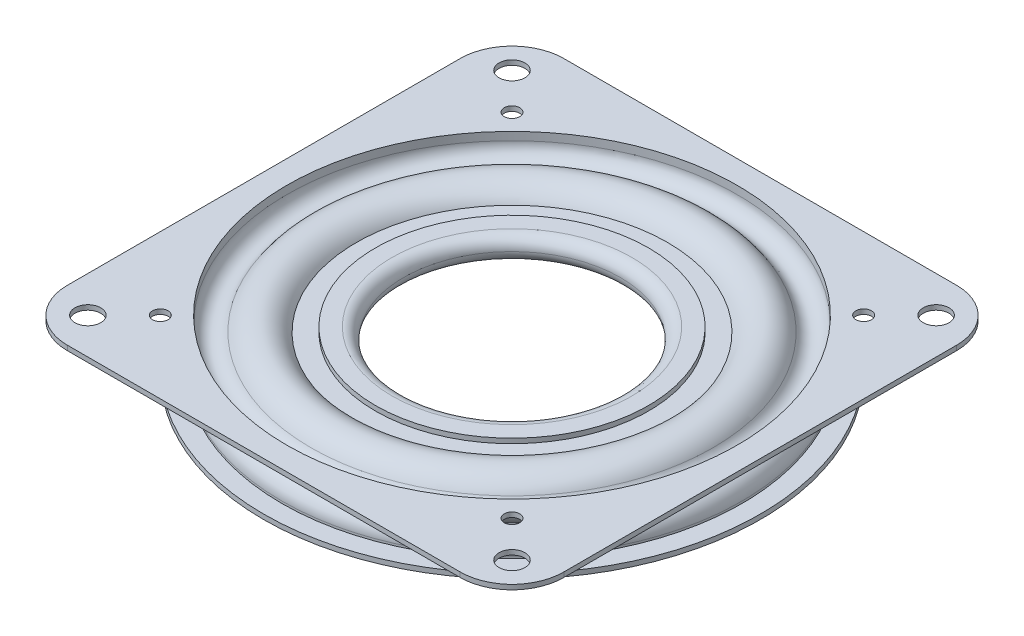
ISO-10303-21;
HEADER;
FILE_DESCRIPTION(('STEP AP214'),'2;1');
FILE_NAME('part.step','',(''),(''),'','','');
FILE_SCHEMA(('AUTOMOTIVE_DESIGN { 1 0 10303 214 1 1 1 1 }'));
ENDSEC;
DATA;
#1=APPLICATION_CONTEXT('core data for automotive mechanical design processes');
#2=APPLICATION_PROTOCOL_DEFINITION('international standard','automotive_design',2000,#1);
#3=PRODUCT_CONTEXT('',#1,'mechanical');
#4=PRODUCT('Part','Part','',(#3));
#5=PRODUCT_RELATED_PRODUCT_CATEGORY('part','',(#4));
#6=PRODUCT_DEFINITION_FORMATION('','',#4);
#7=PRODUCT_DEFINITION_CONTEXT('part definition',#1,'design');
#8=PRODUCT_DEFINITION('design','',#6,#7);
#9=PRODUCT_DEFINITION_SHAPE('','',#8);
#10=(LENGTH_UNIT() NAMED_UNIT(*) SI_UNIT(.MILLI.,.METRE.));
#11=(NAMED_UNIT(*) PLANE_ANGLE_UNIT() SI_UNIT($,.RADIAN.));
#12=(NAMED_UNIT(*) SI_UNIT($,.STERADIAN.) SOLID_ANGLE_UNIT());
#13=UNCERTAINTY_MEASURE_WITH_UNIT(LENGTH_MEASURE(1.E-05),#10,'distance_accuracy_value','');
#14=(GEOMETRIC_REPRESENTATION_CONTEXT(3) GLOBAL_UNCERTAINTY_ASSIGNED_CONTEXT((#13)) GLOBAL_UNIT_ASSIGNED_CONTEXT((#10,
#11,#12)) REPRESENTATION_CONTEXT('',''));
#15=CARTESIAN_POINT('',(0.,0.,0.));
#16=DIRECTION('',(0.,0.,1.));
#17=DIRECTION('',(1.,0.,0.));
#18=AXIS2_PLACEMENT_3D('',#15,#16,#17);
#19=CARTESIAN_POINT('',(-13.6842499999998,-0.850899999999998,-23.7018162634745));
#20=DIRECTION('',(0.,1.,0.));
#21=DIRECTION('',(-0.499999999999992,0.,-0.866025403784443));
#22=AXIS2_PLACEMENT_3D('',#19,#20,#21);
#23=SPHERICAL_SURFACE('',#22,3.36549999999999);
#24=CARTESIAN_POINT('',(-13.6842499999998,2.5146,-23.7018162634745));
#25=VERTEX_POINT('',#24);
#26=VERTEX_LOOP('',#25);
#27=FACE_BOUND('',#26,.T.);
#28=ADVANCED_FACE('F43',(#27),#23,.T.);
#29=CLOSED_SHELL('',(#28));
#30=MANIFOLD_SOLID_BREP('B2',#29);
#31=CARTESIAN_POINT('',(-13.6842500000001,-0.850899999999998,23.7018162634744));
#32=DIRECTION('',(0.,1.,0.));
#33=DIRECTION('',(-0.500000000000004,0.,0.866025403784436));
#34=AXIS2_PLACEMENT_3D('',#31,#32,#33);
#35=SPHERICAL_SURFACE('',#34,3.36549999999999);
#36=CARTESIAN_POINT('',(-13.6842500000001,2.5146,23.7018162634744));
#37=VERTEX_POINT('',#36);
#38=VERTEX_LOOP('',#37);
#39=FACE_BOUND('',#38,.T.);
#40=ADVANCED_FACE('F61',(#39),#35,.T.);
#41=CLOSED_SHELL('',(#40));
#42=MANIFOLD_SOLID_BREP('B7',#41);
#43=CARTESIAN_POINT('',(27.3685,-0.850899999999998,0.));
#44=DIRECTION('',(0.,1.,0.));
#45=DIRECTION('',(1.,0.,0.));
#46=AXIS2_PLACEMENT_3D('',#43,#44,#45);
#47=SPHERICAL_SURFACE('',#46,3.36549999999999);
#48=CARTESIAN_POINT('',(27.3685,2.5146,0.));
#49=VERTEX_POINT('',#48);
#50=VERTEX_LOOP('',#49);
#51=FACE_BOUND('',#50,.T.);
#52=ADVANCED_FACE('F83',(#51),#47,.T.);
#53=CLOSED_SHELL('',(#52));
#54=MANIFOLD_SOLID_BREP('B39',#53);
#55=CARTESIAN_POINT('',(34.557781480959,2.5654,0.));
#56=DIRECTION('',(0.,1.,0.));
#57=DIRECTION('',(0.,0.,1.));
#58=AXIS2_PLACEMENT_3D('',#55,#56,#57);
#59=PLANE('',#58);
#60=CARTESIAN_POINT('',(-26.9875,2.5654,-26.9875));
#61=DIRECTION('',(0.,1.,0.));
#62=DIRECTION('',(0.,0.,1.));
#63=AXIS2_PLACEMENT_3D('',#60,#61,#62);
#64=CIRCLE('',#63,1.19125999999999);
#65=CARTESIAN_POINT('',(-26.9875,2.5654,-25.79624));
#66=VERTEX_POINT('',#65);
#67=EDGE_CURVE('E347',#66,#66,#64,.T.);
#68=ORIENTED_EDGE('',*,*,#67,.T.);
#69=EDGE_LOOP('',(#68));
#70=FACE_BOUND('',#69,.T.);
#71=CARTESIAN_POINT('',(26.9875,2.5654,-26.9875));
#72=DIRECTION('',(0.,1.,0.));
#73=DIRECTION('',(0.,0.,1.));
#74=AXIS2_PLACEMENT_3D('',#71,#72,#73);
#75=CIRCLE('',#74,1.19125999999999);
#76=CARTESIAN_POINT('',(26.9875,2.5654,-25.79624));
#77=VERTEX_POINT('',#76);
#78=EDGE_CURVE('E341',#77,#77,#75,.T.);
#79=ORIENTED_EDGE('',*,*,#78,.T.);
#80=EDGE_LOOP('',(#79));
#81=FACE_BOUND('',#80,.T.);
#82=CARTESIAN_POINT('',(26.9875,2.5654,26.9875));
#83=DIRECTION('',(0.,1.,0.));
#84=DIRECTION('',(0.,0.,1.));
#85=AXIS2_PLACEMENT_3D('',#82,#83,#84);
#86=CIRCLE('',#85,1.19125999999999);
#87=CARTESIAN_POINT('',(26.9875,2.5654,28.17876));
#88=VERTEX_POINT('',#87);
#89=EDGE_CURVE('E335',#88,#88,#86,.T.);
#90=ORIENTED_EDGE('',*,*,#89,.T.);
#91=EDGE_LOOP('',(#90));
#92=FACE_BOUND('',#91,.T.);
#93=CARTESIAN_POINT('',(-26.9875,2.5654,26.9875));
#94=DIRECTION('',(0.,1.,0.));
#95=DIRECTION('',(0.,0.,1.));
#96=AXIS2_PLACEMENT_3D('',#93,#94,#95);
#97=CIRCLE('',#96,1.19125999999999);
#98=CARTESIAN_POINT('',(-26.9875,2.5654,28.17876));
#99=VERTEX_POINT('',#98);
#100=EDGE_CURVE('E329',#99,#99,#97,.T.);
#101=ORIENTED_EDGE('',*,*,#100,.T.);
#102=EDGE_LOOP('',(#101));
#103=FACE_BOUND('',#102,.T.);
#104=CARTESIAN_POINT('',(32.5501,2.5654,-32.5501));
#105=DIRECTION('',(0.,1.,0.));
#106=DIRECTION('',(0.,0.,1.));
#107=AXIS2_PLACEMENT_3D('',#104,#105,#106);
#108=CIRCLE('',#107,1.98437499999999);
#109=CARTESIAN_POINT('',(32.5501,2.5654,-30.565725));
#110=VERTEX_POINT('',#109);
#111=EDGE_CURVE('E323',#110,#110,#108,.T.);
#112=ORIENTED_EDGE('',*,*,#111,.T.);
#113=EDGE_LOOP('',(#112));
#114=FACE_BOUND('',#113,.T.);
#115=CARTESIAN_POINT('',(-32.5501,2.5654,-32.5501));
#116=DIRECTION('',(0.,1.,0.));
#117=DIRECTION('',(0.,0.,1.));
#118=AXIS2_PLACEMENT_3D('',#115,#116,#117);
#119=CIRCLE('',#118,1.98437499999999);
#120=CARTESIAN_POINT('',(-32.5501,2.5654,-30.565725));
#121=VERTEX_POINT('',#120);
#122=EDGE_CURVE('E317',#121,#121,#119,.T.);
#123=ORIENTED_EDGE('',*,*,#122,.T.);
#124=EDGE_LOOP('',(#123));
#125=FACE_BOUND('',#124,.T.);
#126=CARTESIAN_POINT('',(-32.5501,2.5654,32.5501));
#127=DIRECTION('',(0.,1.,0.));
#128=DIRECTION('',(0.,0.,1.));
#129=AXIS2_PLACEMENT_3D('',#126,#127,#128);
#130=CIRCLE('',#129,1.98437499999999);
#131=CARTESIAN_POINT('',(-32.5501,2.5654,34.534475));
#132=VERTEX_POINT('',#131);
#133=EDGE_CURVE('E311',#132,#132,#130,.T.);
#134=ORIENTED_EDGE('',*,*,#133,.T.);
#135=EDGE_LOOP('',(#134));
#136=FACE_BOUND('',#135,.T.);
#137=CARTESIAN_POINT('',(32.5501,2.5654,32.5501));
#138=DIRECTION('',(0.,1.,0.));
#139=DIRECTION('',(0.,0.,1.));
#140=AXIS2_PLACEMENT_3D('',#137,#138,#139);
#141=CIRCLE('',#140,1.98437499999999);
#142=CARTESIAN_POINT('',(32.5501,2.5654,34.534475));
#143=VERTEX_POINT('',#142);
#144=EDGE_CURVE('E301',#143,#143,#141,.T.);
#145=ORIENTED_EDGE('',*,*,#144,.T.);
#146=EDGE_LOOP('',(#145));
#147=FACE_BOUND('',#146,.T.);
#148=DIRECTION('',(0.,0.,-1.));
#149=VECTOR('',#148,1.);
#150=CARTESIAN_POINT('',(-38.1,2.5654,-38.1));
#151=LINE('',#150,#149);
#152=CARTESIAN_POINT('',(-38.1,2.5654,30.1498));
#153=VERTEX_POINT('',#152);
#154=CARTESIAN_POINT('',(-38.1,2.5654,-30.1498));
#155=VERTEX_POINT('',#154);
#156=EDGE_CURVE('E173',#153,#155,#151,.T.);
#157=ORIENTED_EDGE('',*,*,#156,.T.);
#158=CARTESIAN_POINT('',(-30.1498,2.5654,-30.1498));
#159=DIRECTION('',(0.,1.,0.));
#160=DIRECTION('',(0.,0.,1.));
#161=AXIS2_PLACEMENT_3D('',#158,#159,#160);
#162=CIRCLE('',#161,7.9502);
#163=CARTESIAN_POINT('',(-30.1498,2.5654,-38.1));
#164=VERTEX_POINT('',#163);
#165=EDGE_CURVE('E167',#155,#164,#162,.F.);
#166=ORIENTED_EDGE('',*,*,#165,.T.);
#167=DIRECTION('',(1.,0.,0.));
#168=VECTOR('',#167,1.);
#169=CARTESIAN_POINT('',(38.1,2.5654,-38.1));
#170=LINE('',#169,#168);
#171=CARTESIAN_POINT('',(30.1498,2.5654,-38.1));
#172=VERTEX_POINT('',#171);
#173=EDGE_CURVE('E170',#164,#172,#170,.T.);
#174=ORIENTED_EDGE('',*,*,#173,.T.);
#175=CARTESIAN_POINT('',(30.1498,2.5654,-30.1498));
#176=DIRECTION('',(0.,1.,0.));
#177=DIRECTION('',(0.,0.,1.));
#178=AXIS2_PLACEMENT_3D('',#175,#176,#177);
#179=CIRCLE('',#178,7.9502);
#180=CARTESIAN_POINT('',(38.1,2.5654,-30.1498));
#181=VERTEX_POINT('',#180);
#182=EDGE_CURVE('E178',#172,#181,#179,.F.);
#183=ORIENTED_EDGE('',*,*,#182,.T.);
#184=DIRECTION('',(0.,0.,1.));
#185=VECTOR('',#184,1.);
#186=CARTESIAN_POINT('',(38.1,2.5654,-38.1));
#187=LINE('',#186,#185);
#188=CARTESIAN_POINT('',(38.1,2.5654,30.1498));
#189=VERTEX_POINT('',#188);
#190=EDGE_CURVE('E189',#181,#189,#187,.T.);
#191=ORIENTED_EDGE('',*,*,#190,.T.);
#192=CARTESIAN_POINT('',(30.1498,2.5654,30.1498));
#193=DIRECTION('',(0.,1.,0.));
#194=DIRECTION('',(0.,0.,1.));
#195=AXIS2_PLACEMENT_3D('',#192,#193,#194);
#196=CIRCLE('',#195,7.9502);
#197=CARTESIAN_POINT('',(30.1498,2.5654,38.1));
#198=VERTEX_POINT('',#197);
#199=EDGE_CURVE('E122',#189,#198,#196,.F.);
#200=ORIENTED_EDGE('',*,*,#199,.T.);
#201=DIRECTION('',(-1.,0.,0.));
#202=VECTOR('',#201,1.);
#203=CARTESIAN_POINT('',(38.1,2.5654,38.1));
#204=LINE('',#203,#202);
#205=CARTESIAN_POINT('',(-30.1498,2.5654,38.1));
#206=VERTEX_POINT('',#205);
#207=EDGE_CURVE('E222',#198,#206,#204,.T.);
#208=ORIENTED_EDGE('',*,*,#207,.T.);
#209=CARTESIAN_POINT('',(-30.1498,2.5654,30.1498));
#210=DIRECTION('',(0.,1.,0.));
#211=DIRECTION('',(0.,0.,1.));
#212=AXIS2_PLACEMENT_3D('',#209,#210,#211);
#213=CIRCLE('',#212,7.9502);
#214=EDGE_CURVE('E211',#206,#153,#213,.F.);
#215=ORIENTED_EDGE('',*,*,#214,.T.);
#216=EDGE_LOOP('',(#157,#166,#174,#183,#191,#200,#208,#215));
#217=FACE_BOUND('',#216,.T.);
#218=CARTESIAN_POINT('',(0.,2.5654,0.));
#219=DIRECTION('',(0.,1.,0.));
#220=DIRECTION('',(0.,0.,1.));
#221=AXIS2_PLACEMENT_3D('',#218,#219,#220);
#222=CIRCLE('',#221,35.294381480959);
#223=CARTESIAN_POINT('',(0.,2.5654,35.294381480959));
#224=VERTEX_POINT('',#223);
#225=EDGE_CURVE('E188',#224,#224,#222,.T.);
#226=ORIENTED_EDGE('',*,*,#225,.T.);
#227=EDGE_LOOP('',(#226));
#228=FACE_BOUND('',#227,.T.);
#229=ADVANCED_FACE('F102',(#70,#81,#92,#103,#114,#125,#136,#147,#217,#228),#59,.F.);
#230=CARTESIAN_POINT('',(34.557781480959,3.302,0.));
#231=DIRECTION('',(0.,1.,0.));
#232=DIRECTION('',(0.,0.,1.));
#233=AXIS2_PLACEMENT_3D('',#230,#231,#232);
#234=PLANE('',#233);
#235=CARTESIAN_POINT('',(-26.9875,3.302,-26.9875));
#236=DIRECTION('',(0.,1.,0.));
#237=DIRECTION('',(0.,0.,1.));
#238=AXIS2_PLACEMENT_3D('',#235,#236,#237);
#239=CIRCLE('',#238,1.19125999999999);
#240=CARTESIAN_POINT('',(-26.9875,3.302,-25.79624));
#241=VERTEX_POINT('',#240);
#242=EDGE_CURVE('E350',#241,#241,#239,.T.);
#243=ORIENTED_EDGE('',*,*,#242,.F.);
#244=EDGE_LOOP('',(#243));
#245=FACE_BOUND('',#244,.T.);
#246=CARTESIAN_POINT('',(26.9875,3.302,-26.9875));
#247=DIRECTION('',(0.,1.,0.));
#248=DIRECTION('',(0.,0.,1.));
#249=AXIS2_PLACEMENT_3D('',#246,#247,#248);
#250=CIRCLE('',#249,1.19125999999999);
#251=CARTESIAN_POINT('',(26.9875,3.302,-25.79624));
#252=VERTEX_POINT('',#251);
#253=EDGE_CURVE('E344',#252,#252,#250,.T.);
#254=ORIENTED_EDGE('',*,*,#253,.F.);
#255=EDGE_LOOP('',(#254));
#256=FACE_BOUND('',#255,.T.);
#257=CARTESIAN_POINT('',(26.9875,3.302,26.9875));
#258=DIRECTION('',(0.,1.,0.));
#259=DIRECTION('',(0.,0.,1.));
#260=AXIS2_PLACEMENT_3D('',#257,#258,#259);
#261=CIRCLE('',#260,1.19125999999999);
#262=CARTESIAN_POINT('',(26.9875,3.302,28.17876));
#263=VERTEX_POINT('',#262);
#264=EDGE_CURVE('E338',#263,#263,#261,.T.);
#265=ORIENTED_EDGE('',*,*,#264,.F.);
#266=EDGE_LOOP('',(#265));
#267=FACE_BOUND('',#266,.T.);
#268=CARTESIAN_POINT('',(-26.9875,3.302,26.9875));
#269=DIRECTION('',(0.,1.,0.));
#270=DIRECTION('',(0.,0.,1.));
#271=AXIS2_PLACEMENT_3D('',#268,#269,#270);
#272=CIRCLE('',#271,1.19125999999999);
#273=CARTESIAN_POINT('',(-26.9875,3.302,28.17876));
#274=VERTEX_POINT('',#273);
#275=EDGE_CURVE('E332',#274,#274,#272,.T.);
#276=ORIENTED_EDGE('',*,*,#275,.F.);
#277=EDGE_LOOP('',(#276));
#278=FACE_BOUND('',#277,.T.);
#279=CARTESIAN_POINT('',(32.5501,3.302,-32.5501));
#280=DIRECTION('',(0.,1.,0.));
#281=DIRECTION('',(0.,0.,1.));
#282=AXIS2_PLACEMENT_3D('',#279,#280,#281);
#283=CIRCLE('',#282,1.98437499999999);
#284=CARTESIAN_POINT('',(32.5501,3.302,-30.565725));
#285=VERTEX_POINT('',#284);
#286=EDGE_CURVE('E326',#285,#285,#283,.T.);
#287=ORIENTED_EDGE('',*,*,#286,.F.);
#288=EDGE_LOOP('',(#287));
#289=FACE_BOUND('',#288,.T.);
#290=CARTESIAN_POINT('',(-32.5501,3.302,-32.5501));
#291=DIRECTION('',(0.,1.,0.));
#292=DIRECTION('',(0.,0.,1.));
#293=AXIS2_PLACEMENT_3D('',#290,#291,#292);
#294=CIRCLE('',#293,1.98437499999999);
#295=CARTESIAN_POINT('',(-32.5501,3.302,-30.565725));
#296=VERTEX_POINT('',#295);
#297=EDGE_CURVE('E320',#296,#296,#294,.T.);
#298=ORIENTED_EDGE('',*,*,#297,.F.);
#299=EDGE_LOOP('',(#298));
#300=FACE_BOUND('',#299,.T.);
#301=CARTESIAN_POINT('',(-32.5501,3.302,32.5501));
#302=DIRECTION('',(0.,1.,0.));
#303=DIRECTION('',(0.,0.,1.));
#304=AXIS2_PLACEMENT_3D('',#301,#302,#303);
#305=CIRCLE('',#304,1.98437499999999);
#306=CARTESIAN_POINT('',(-32.5501,3.302,34.534475));
#307=VERTEX_POINT('',#306);
#308=EDGE_CURVE('E314',#307,#307,#305,.T.);
#309=ORIENTED_EDGE('',*,*,#308,.F.);
#310=EDGE_LOOP('',(#309));
#311=FACE_BOUND('',#310,.T.);
#312=CARTESIAN_POINT('',(32.5501,3.302,32.5501));
#313=DIRECTION('',(0.,1.,0.));
#314=DIRECTION('',(0.,0.,1.));
#315=AXIS2_PLACEMENT_3D('',#312,#313,#314);
#316=CIRCLE('',#315,1.98437499999999);
#317=CARTESIAN_POINT('',(32.5501,3.302,34.534475));
#318=VERTEX_POINT('',#317);
#319=EDGE_CURVE('E308',#318,#318,#316,.T.);
#320=ORIENTED_EDGE('',*,*,#319,.F.);
#321=EDGE_LOOP('',(#320));
#322=FACE_BOUND('',#321,.T.);
#323=DIRECTION('',(-1.,0.,0.));
#324=VECTOR('',#323,1.);
#325=CARTESIAN_POINT('',(38.1,3.302,-38.1));
#326=LINE('',#325,#324);
#327=CARTESIAN_POINT('',(30.1498,3.302,-38.1));
#328=VERTEX_POINT('',#327);
#329=CARTESIAN_POINT('',(-30.1498,3.302,-38.1));
#330=VERTEX_POINT('',#329);
#331=EDGE_CURVE('E233',#328,#330,#326,.T.);
#332=ORIENTED_EDGE('',*,*,#331,.T.);
#333=CARTESIAN_POINT('',(-30.1498,3.302,-30.1498));
#334=DIRECTION('',(0.,1.,0.));
#335=DIRECTION('',(0.,0.,1.));
#336=AXIS2_PLACEMENT_3D('',#333,#334,#335);
#337=CIRCLE('',#336,7.9502);
#338=CARTESIAN_POINT('',(-38.1,3.302,-30.1498));
#339=VERTEX_POINT('',#338);
#340=EDGE_CURVE('E192',#330,#339,#337,.T.);
#341=ORIENTED_EDGE('',*,*,#340,.T.);
#342=DIRECTION('',(0.,0.,1.));
#343=VECTOR('',#342,1.);
#344=CARTESIAN_POINT('',(-38.1,3.302,-38.1));
#345=LINE('',#344,#343);
#346=CARTESIAN_POINT('',(-38.1,3.302,30.1498));
#347=VERTEX_POINT('',#346);
#348=EDGE_CURVE('E230',#339,#347,#345,.T.);
#349=ORIENTED_EDGE('',*,*,#348,.T.);
#350=CARTESIAN_POINT('',(-30.1498,3.302,30.1498));
#351=DIRECTION('',(0.,1.,0.));
#352=DIRECTION('',(0.,0.,1.));
#353=AXIS2_PLACEMENT_3D('',#350,#351,#352);
#354=CIRCLE('',#353,7.9502);
#355=CARTESIAN_POINT('',(-30.1498,3.302,38.1));
#356=VERTEX_POINT('',#355);
#357=EDGE_CURVE('E195',#347,#356,#354,.T.);
#358=ORIENTED_EDGE('',*,*,#357,.T.);
#359=DIRECTION('',(1.,0.,0.));
#360=VECTOR('',#359,1.);
#361=CARTESIAN_POINT('',(38.1,3.302,38.1));
#362=LINE('',#361,#360);
#363=CARTESIAN_POINT('',(30.1498,3.302,38.1));
#364=VERTEX_POINT('',#363);
#365=EDGE_CURVE('E221',#356,#364,#362,.T.);
#366=ORIENTED_EDGE('',*,*,#365,.T.);
#367=CARTESIAN_POINT('',(30.1498,3.302,30.1498));
#368=DIRECTION('',(0.,1.,0.));
#369=DIRECTION('',(0.,0.,1.));
#370=AXIS2_PLACEMENT_3D('',#367,#368,#369);
#371=CIRCLE('',#370,7.9502);
#372=CARTESIAN_POINT('',(38.1,3.302,30.1498));
#373=VERTEX_POINT('',#372);
#374=EDGE_CURVE('E193',#364,#373,#371,.T.);
#375=ORIENTED_EDGE('',*,*,#374,.T.);
#376=DIRECTION('',(0.,0.,-1.));
#377=VECTOR('',#376,1.);
#378=CARTESIAN_POINT('',(38.1,3.302,-38.1));
#379=LINE('',#378,#377);
#380=CARTESIAN_POINT('',(38.1,3.302,-30.1498));
#381=VERTEX_POINT('',#380);
#382=EDGE_CURVE('E300',#373,#381,#379,.T.);
#383=ORIENTED_EDGE('',*,*,#382,.T.);
#384=CARTESIAN_POINT('',(30.1498,3.302,-30.1498));
#385=DIRECTION('',(0.,1.,0.));
#386=DIRECTION('',(0.,0.,1.));
#387=AXIS2_PLACEMENT_3D('',#384,#385,#386);
#388=CIRCLE('',#387,7.9502);
#389=EDGE_CURVE('E202',#381,#328,#388,.T.);
#390=ORIENTED_EDGE('',*,*,#389,.T.);
#391=EDGE_LOOP('',(#332,#341,#349,#358,#366,#375,#383,#390));
#392=FACE_BOUND('',#391,.T.);
#393=CARTESIAN_POINT('',(0.,3.302,0.));
#394=DIRECTION('',(0.,1.,0.));
#395=DIRECTION('',(0.,0.,1.));
#396=AXIS2_PLACEMENT_3D('',#393,#394,#395);
#397=CIRCLE('',#396,34.557781480959);
#398=CARTESIAN_POINT('',(0.,3.302,34.557781480959));
#399=VERTEX_POINT('',#398);
#400=EDGE_CURVE('E197',#399,#399,#397,.T.);
#401=ORIENTED_EDGE('',*,*,#400,.F.);
#402=EDGE_LOOP('',(#401));
#403=FACE_BOUND('',#402,.T.);
#404=ADVANCED_FACE('F225',(#245,#256,#267,#278,#289,#300,#311,#322,#392,#403),#234,.T.);
#405=CARTESIAN_POINT('',(0.,21.7127262600922,0.));
#406=DIRECTION('',(0.,1.,0.));
#407=DIRECTION('',(0.,0.,1.));
#408=AXIS2_PLACEMENT_3D('',#405,#406,#407);
#409=CYLINDRICAL_SURFACE('',#408,34.557781480959);
#410=ORIENTED_EDGE('',*,*,#400,.T.);
#411=EDGE_LOOP('',(#410));
#412=FACE_BOUND('',#411,.T.);
#413=CARTESIAN_POINT('',(0.,2.06375000000002,0.));
#414=DIRECTION('',(0.,1.,0.));
#415=DIRECTION('',(0.,0.,1.));
#416=AXIS2_PLACEMENT_3D('',#413,#414,#415);
#417=CIRCLE('',#416,34.557781480959);
#418=CARTESIAN_POINT('',(0.,2.06375000000002,34.557781480959));
#419=VERTEX_POINT('',#418);
#420=EDGE_CURVE('E260',#419,#419,#417,.T.);
#421=ORIENTED_EDGE('',*,*,#420,.F.);
#422=EDGE_LOOP('',(#421));
#423=FACE_BOUND('',#422,.T.);
#424=ADVANCED_FACE('F265',(#412,#423),#409,.F.);
#425=CARTESIAN_POINT('',(0.,2.06375000000002,0.));
#426=DIRECTION('',(0.,1.,0.));
#427=DIRECTION('',(0.,0.,1.));
#428=AXIS2_PLACEMENT_3D('',#425,#426,#427);
#429=TOROIDAL_SURFACE('',#428,32.570231480959,1.98755);
#430=ORIENTED_EDGE('',*,*,#420,.T.);
#431=EDGE_LOOP('',(#430));
#432=FACE_BOUND('',#431,.T.);
#433=CARTESIAN_POINT('',(0.,1.09220000000001,0.));
#434=DIRECTION('',(0.,1.,0.));
#435=DIRECTION('',(0.,0.,1.));
#436=AXIS2_PLACEMENT_3D('',#433,#434,#435);
#437=CIRCLE('',#436,30.836320987306);
#438=CARTESIAN_POINT('',(0.,1.09220000000001,30.836320987306));
#439=VERTEX_POINT('',#438);
#440=EDGE_CURVE('E257',#439,#439,#437,.T.);
#441=ORIENTED_EDGE('',*,*,#440,.F.);
#442=EDGE_LOOP('',(#441));
#443=FACE_BOUND('',#442,.T.);
#444=ADVANCED_FACE('F274',(#432,#443),#429,.F.);
#445=CARTESIAN_POINT('',(0.,-0.850899999999998,0.));
#446=DIRECTION('',(0.,1.,0.));
#447=DIRECTION('',(0.,0.,1.));
#448=AXIS2_PLACEMENT_3D('',#445,#446,#447);
#449=TOROIDAL_SURFACE('',#448,27.3685,3.9751);
#450=ORIENTED_EDGE('',*,*,#440,.T.);
#451=EDGE_LOOP('',(#450));
#452=FACE_BOUND('',#451,.T.);
#453=CARTESIAN_POINT('',(0.,1.0414,0.));
#454=DIRECTION('',(0.,1.,0.));
#455=DIRECTION('',(0.,0.,1.));
#456=AXIS2_PLACEMENT_3D('',#453,#454,#455);
#457=CIRCLE('',#456,23.8726995594714);
#458=CARTESIAN_POINT('',(0.,1.0414,23.8726995594714));
#459=VERTEX_POINT('',#458);
#460=EDGE_CURVE('E254',#459,#459,#457,.T.);
#461=ORIENTED_EDGE('',*,*,#460,.F.);
#462=EDGE_LOOP('',(#461));
#463=FACE_BOUND('',#462,.T.);
#464=ADVANCED_FACE('F418',(#452,#463),#449,.T.);
#465=CARTESIAN_POINT('',(18.415,1.0414,0.));
#466=DIRECTION('',(0.,1.,0.));
#467=DIRECTION('',(0.,0.,1.));
#468=AXIS2_PLACEMENT_3D('',#465,#466,#467);
#469=PLANE('',#468);
#470=ORIENTED_EDGE('',*,*,#460,.T.);
#471=EDGE_LOOP('',(#470));
#472=FACE_BOUND('',#471,.T.);
#473=CARTESIAN_POINT('',(0.,1.0414,0.));
#474=DIRECTION('',(0.,1.,0.));
#475=DIRECTION('',(0.,0.,1.));
#476=AXIS2_PLACEMENT_3D('',#473,#474,#475);
#477=CIRCLE('',#476,18.415);
#478=CARTESIAN_POINT('',(0.,1.0414,18.415));
#479=VERTEX_POINT('',#478);
#480=EDGE_CURVE('E251',#479,#479,#477,.T.);
#481=ORIENTED_EDGE('',*,*,#480,.F.);
#482=EDGE_LOOP('',(#481));
#483=FACE_BOUND('',#482,.T.);
#484=ADVANCED_FACE('F414',(#472,#483),#469,.T.);
#485=CARTESIAN_POINT('',(0.,21.7127262600922,0.));
#486=DIRECTION('',(0.,1.,0.));
#487=DIRECTION('',(0.,0.,1.));
#488=AXIS2_PLACEMENT_3D('',#485,#486,#487);
#489=CYLINDRICAL_SURFACE('',#488,18.415);
#490=ORIENTED_EDGE('',*,*,#480,.T.);
#491=EDGE_LOOP('',(#490));
#492=FACE_BOUND('',#491,.T.);
#493=CARTESIAN_POINT('',(0.,0.304800000000001,0.));
#494=DIRECTION('',(0.,1.,0.));
#495=DIRECTION('',(0.,0.,1.));
#496=AXIS2_PLACEMENT_3D('',#493,#494,#495);
#497=CIRCLE('',#496,18.415);
#498=CARTESIAN_POINT('',(0.,0.304800000000001,18.415));
#499=VERTEX_POINT('',#498);
#500=EDGE_CURVE('E248',#499,#499,#497,.T.);
#501=ORIENTED_EDGE('',*,*,#500,.F.);
#502=EDGE_LOOP('',(#501));
#503=FACE_BOUND('',#502,.T.);
#504=ADVANCED_FACE('F410',(#492,#503),#489,.F.);
#505=CARTESIAN_POINT('',(18.415,0.304800000000001,0.));
#506=DIRECTION('',(0.,1.,0.));
#507=DIRECTION('',(0.,0.,1.));
#508=AXIS2_PLACEMENT_3D('',#505,#506,#507);
#509=PLANE('',#508);
#510=CARTESIAN_POINT('',(0.,0.304800000000001,0.));
#511=DIRECTION('',(0.,1.,0.));
#512=DIRECTION('',(0.,0.,1.));
#513=AXIS2_PLACEMENT_3D('',#510,#511,#512);
#514=CIRCLE('',#513,24.3432331092943);
#515=CARTESIAN_POINT('',(0.,0.304800000000001,24.3432331092943));
#516=VERTEX_POINT('',#515);
#517=EDGE_CURVE('E245',#516,#516,#514,.T.);
#518=ORIENTED_EDGE('',*,*,#517,.F.);
#519=EDGE_LOOP('',(#518));
#520=FACE_BOUND('',#519,.T.);
#521=ORIENTED_EDGE('',*,*,#500,.T.);
#522=EDGE_LOOP('',(#521));
#523=FACE_BOUND('',#522,.T.);
#524=ADVANCED_FACE('F406',(#520,#523),#509,.F.);
#525=CARTESIAN_POINT('',(0.,-0.850899999999998,0.));
#526=DIRECTION('',(0.,1.,0.));
#527=DIRECTION('',(0.,0.,1.));
#528=AXIS2_PLACEMENT_3D('',#525,#526,#527);
#529=TOROIDAL_SURFACE('',#528,27.3685,3.2385);
#530=CARTESIAN_POINT('',(0.,0.732136741214071,0.));
#531=DIRECTION('',(0.,1.,0.));
#532=DIRECTION('',(0.,0.,1.));
#533=AXIS2_PLACEMENT_3D('',#530,#531,#532);
#534=CIRCLE('',#533,30.1937215711279);
#535=CARTESIAN_POINT('',(0.,0.732136741214071,30.1937215711279));
#536=VERTEX_POINT('',#535);
#537=EDGE_CURVE('E242',#536,#536,#534,.T.);
#538=ORIENTED_EDGE('',*,*,#537,.F.);
#539=EDGE_LOOP('',(#538));
#540=FACE_BOUND('',#539,.T.);
#541=ORIENTED_EDGE('',*,*,#517,.T.);
#542=EDGE_LOOP('',(#541));
#543=FACE_BOUND('',#542,.T.);
#544=ADVANCED_FACE('F402',(#540,#543),#529,.F.);
#545=CARTESIAN_POINT('',(0.,2.06375000000002,0.));
#546=DIRECTION('',(0.,1.,0.));
#547=DIRECTION('',(0.,0.,1.));
#548=AXIS2_PLACEMENT_3D('',#545,#546,#547);
#549=TOROIDAL_SURFACE('',#548,32.570231480959,2.72415);
#550=CARTESIAN_POINT('',(0.,2.06375000000002,0.));
#551=DIRECTION('',(0.,1.,0.));
#552=DIRECTION('',(0.,0.,1.));
#553=AXIS2_PLACEMENT_3D('',#550,#551,#552);
#554=CIRCLE('',#553,35.294381480959);
#555=CARTESIAN_POINT('',(0.,2.06375000000002,35.294381480959));
#556=VERTEX_POINT('',#555);
#557=EDGE_CURVE('E239',#556,#556,#554,.T.);
#558=ORIENTED_EDGE('',*,*,#557,.F.);
#559=EDGE_LOOP('',(#558));
#560=FACE_BOUND('',#559,.T.);
#561=ORIENTED_EDGE('',*,*,#537,.T.);
#562=EDGE_LOOP('',(#561));
#563=FACE_BOUND('',#562,.T.);
#564=ADVANCED_FACE('F398',(#560,#563),#549,.T.);
#565=CARTESIAN_POINT('',(0.,21.7127262600922,0.));
#566=DIRECTION('',(0.,1.,0.));
#567=DIRECTION('',(0.,0.,1.));
#568=AXIS2_PLACEMENT_3D('',#565,#566,#567);
#569=CYLINDRICAL_SURFACE('',#568,35.294381480959);
#570=ORIENTED_EDGE('',*,*,#225,.F.);
#571=EDGE_LOOP('',(#570));
#572=FACE_BOUND('',#571,.T.);
#573=ORIENTED_EDGE('',*,*,#557,.T.);
#574=EDGE_LOOP('',(#573));
#575=FACE_BOUND('',#574,.T.);
#576=ADVANCED_FACE('F392',(#572,#575),#569,.T.);
#577=CARTESIAN_POINT('',(38.1,-105.19767345283,-38.1));
#578=DIRECTION('',(0.,0.,-1.));
#579=DIRECTION('',(-1.,0.,0.));
#580=AXIS2_PLACEMENT_3D('',#577,#578,#579);
#581=PLANE('',#580);
#582=ORIENTED_EDGE('',*,*,#173,.F.);
#583=DIRECTION('',(0.,1.,0.));
#584=VECTOR('',#583,1.);
#585=CARTESIAN_POINT('',(-30.1498,-105.19767345283,-38.1));
#586=LINE('',#585,#584);
#587=EDGE_CURVE('E184',#164,#330,#586,.T.);
#588=ORIENTED_EDGE('',*,*,#587,.T.);
#589=ORIENTED_EDGE('',*,*,#331,.F.);
#590=DIRECTION('',(0.,1.,0.));
#591=VECTOR('',#590,1.);
#592=CARTESIAN_POINT('',(30.1498,-105.19767345283,-38.1));
#593=LINE('',#592,#591);
#594=EDGE_CURVE('E187',#328,#172,#593,.F.);
#595=ORIENTED_EDGE('',*,*,#594,.T.);
#596=EDGE_LOOP('',(#582,#588,#589,#595));
#597=FACE_BOUND('',#596,.T.);
#598=ADVANCED_FACE('F182',(#597),#581,.T.);
#599=CARTESIAN_POINT('',(-38.1,-105.19767345283,-38.1));
#600=DIRECTION('',(-1.,0.,0.));
#601=DIRECTION('',(0.,0.,1.));
#602=AXIS2_PLACEMENT_3D('',#599,#600,#601);
#603=PLANE('',#602);
#604=ORIENTED_EDGE('',*,*,#348,.F.);
#605=DIRECTION('',(0.,1.,0.));
#606=VECTOR('',#605,1.);
#607=CARTESIAN_POINT('',(-38.1,-105.19767345283,-30.1498));
#608=LINE('',#607,#606);
#609=EDGE_CURVE('E208',#339,#155,#608,.F.);
#610=ORIENTED_EDGE('',*,*,#609,.T.);
#611=ORIENTED_EDGE('',*,*,#156,.F.);
#612=DIRECTION('',(0.,1.,0.));
#613=VECTOR('',#612,1.);
#614=CARTESIAN_POINT('',(-38.1,-105.19767345283,30.1498));
#615=LINE('',#614,#613);
#616=EDGE_CURVE('E205',#153,#347,#615,.T.);
#617=ORIENTED_EDGE('',*,*,#616,.T.);
#618=EDGE_LOOP('',(#604,#610,#611,#617));
#619=FACE_BOUND('',#618,.T.);
#620=ADVANCED_FACE('F299',(#619),#603,.T.);
#621=CARTESIAN_POINT('',(38.1,-105.19767345283,38.1));
#622=DIRECTION('',(0.,0.,1.));
#623=DIRECTION('',(1.,0.,0.));
#624=AXIS2_PLACEMENT_3D('',#621,#622,#623);
#625=PLANE('',#624);
#626=ORIENTED_EDGE('',*,*,#365,.F.);
#627=DIRECTION('',(0.,1.,0.));
#628=VECTOR('',#627,1.);
#629=CARTESIAN_POINT('',(-30.1498,-105.19767345283,38.1));
#630=LINE('',#629,#628);
#631=EDGE_CURVE('E81',#356,#206,#630,.F.);
#632=ORIENTED_EDGE('',*,*,#631,.T.);
#633=ORIENTED_EDGE('',*,*,#207,.F.);
#634=DIRECTION('',(0.,1.,0.));
#635=VECTOR('',#634,1.);
#636=CARTESIAN_POINT('',(30.1498,-105.19767345283,38.1));
#637=LINE('',#636,#635);
#638=EDGE_CURVE('E110',#198,#364,#637,.T.);
#639=ORIENTED_EDGE('',*,*,#638,.T.);
#640=EDGE_LOOP('',(#626,#632,#633,#639));
#641=FACE_BOUND('',#640,.T.);
#642=ADVANCED_FACE('F220',(#641),#625,.T.);
#643=CARTESIAN_POINT('',(38.1,-105.19767345283,-38.1));
#644=DIRECTION('',(1.,0.,0.));
#645=DIRECTION('',(0.,0.,-1.));
#646=AXIS2_PLACEMENT_3D('',#643,#644,#645);
#647=PLANE('',#646);
#648=ORIENTED_EDGE('',*,*,#190,.F.);
#649=DIRECTION('',(0.,1.,0.));
#650=VECTOR('',#649,1.);
#651=CARTESIAN_POINT('',(38.1,-105.19767345283,-30.1498));
#652=LINE('',#651,#650);
#653=EDGE_CURVE('E215',#181,#381,#652,.T.);
#654=ORIENTED_EDGE('',*,*,#653,.T.);
#655=ORIENTED_EDGE('',*,*,#382,.F.);
#656=DIRECTION('',(0.,1.,0.));
#657=VECTOR('',#656,1.);
#658=CARTESIAN_POINT('',(38.1,-105.19767345283,30.1498));
#659=LINE('',#658,#657);
#660=EDGE_CURVE('E177',#373,#189,#659,.F.);
#661=ORIENTED_EDGE('',*,*,#660,.T.);
#662=EDGE_LOOP('',(#648,#654,#655,#661));
#663=FACE_BOUND('',#662,.T.);
#664=ADVANCED_FACE('F285',(#663),#647,.T.);
#665=CARTESIAN_POINT('',(-30.1498,-105.19767345283,-30.1498));
#666=DIRECTION('',(0.,1.,0.));
#667=DIRECTION('',(0.,0.,1.));
#668=AXIS2_PLACEMENT_3D('',#665,#666,#667);
#669=CYLINDRICAL_SURFACE('',#668,7.9502);
#670=ORIENTED_EDGE('',*,*,#165,.F.);
#671=ORIENTED_EDGE('',*,*,#609,.F.);
#672=ORIENTED_EDGE('',*,*,#340,.F.);
#673=ORIENTED_EDGE('',*,*,#587,.F.);
#674=EDGE_LOOP('',(#670,#671,#672,#673));
#675=FACE_BOUND('',#674,.T.);
#676=ADVANCED_FACE('F191',(#675),#669,.T.);
#677=CARTESIAN_POINT('',(30.1498,-105.19767345283,-30.1498));
#678=DIRECTION('',(0.,1.,0.));
#679=DIRECTION('',(0.,0.,1.));
#680=AXIS2_PLACEMENT_3D('',#677,#678,#679);
#681=CYLINDRICAL_SURFACE('',#680,7.9502);
#682=ORIENTED_EDGE('',*,*,#182,.F.);
#683=ORIENTED_EDGE('',*,*,#594,.F.);
#684=ORIENTED_EDGE('',*,*,#389,.F.);
#685=ORIENTED_EDGE('',*,*,#653,.F.);
#686=EDGE_LOOP('',(#682,#683,#684,#685));
#687=FACE_BOUND('',#686,.T.);
#688=ADVANCED_FACE('F284',(#687),#681,.T.);
#689=CARTESIAN_POINT('',(-30.1498,-105.19767345283,30.1498));
#690=DIRECTION('',(0.,1.,0.));
#691=DIRECTION('',(0.,0.,1.));
#692=AXIS2_PLACEMENT_3D('',#689,#690,#691);
#693=CYLINDRICAL_SURFACE('',#692,7.9502);
#694=ORIENTED_EDGE('',*,*,#214,.F.);
#695=ORIENTED_EDGE('',*,*,#631,.F.);
#696=ORIENTED_EDGE('',*,*,#357,.F.);
#697=ORIENTED_EDGE('',*,*,#616,.F.);
#698=EDGE_LOOP('',(#694,#695,#696,#697));
#699=FACE_BOUND('',#698,.T.);
#700=ADVANCED_FACE('F287',(#699),#693,.T.);
#701=CARTESIAN_POINT('',(30.1498,-105.19767345283,30.1498));
#702=DIRECTION('',(0.,1.,0.));
#703=DIRECTION('',(0.,0.,1.));
#704=AXIS2_PLACEMENT_3D('',#701,#702,#703);
#705=CYLINDRICAL_SURFACE('',#704,7.9502);
#706=ORIENTED_EDGE('',*,*,#199,.F.);
#707=ORIENTED_EDGE('',*,*,#660,.F.);
#708=ORIENTED_EDGE('',*,*,#374,.F.);
#709=ORIENTED_EDGE('',*,*,#638,.F.);
#710=EDGE_LOOP('',(#706,#707,#708,#709));
#711=FACE_BOUND('',#710,.T.);
#712=ADVANCED_FACE('F104',(#711),#705,.T.);
#713=CARTESIAN_POINT('',(32.5501,3.302,32.5501));
#714=DIRECTION('',(0.,1.,0.));
#715=DIRECTION('',(0.,0.,1.));
#716=AXIS2_PLACEMENT_3D('',#713,#714,#715);
#717=CYLINDRICAL_SURFACE('',#716,1.98437499999999);
#718=ORIENTED_EDGE('',*,*,#319,.T.);
#719=EDGE_LOOP('',(#718));
#720=FACE_BOUND('',#719,.T.);
#721=ORIENTED_EDGE('',*,*,#144,.F.);
#722=EDGE_LOOP('',(#721));
#723=FACE_BOUND('',#722,.T.);
#724=ADVANCED_FACE('F294',(#720,#723),#717,.F.);
#725=CARTESIAN_POINT('',(-32.5501,3.302,32.5501));
#726=DIRECTION('',(0.,1.,0.));
#727=DIRECTION('',(0.,0.,1.));
#728=AXIS2_PLACEMENT_3D('',#725,#726,#727);
#729=CYLINDRICAL_SURFACE('',#728,1.98437499999999);
#730=ORIENTED_EDGE('',*,*,#308,.T.);
#731=EDGE_LOOP('',(#730));
#732=FACE_BOUND('',#731,.T.);
#733=ORIENTED_EDGE('',*,*,#133,.F.);
#734=EDGE_LOOP('',(#733));
#735=FACE_BOUND('',#734,.T.);
#736=ADVANCED_FACE('F375',(#732,#735),#729,.F.);
#737=CARTESIAN_POINT('',(-32.5501,3.302,-32.5501));
#738=DIRECTION('',(0.,1.,0.));
#739=DIRECTION('',(0.,0.,1.));
#740=AXIS2_PLACEMENT_3D('',#737,#738,#739);
#741=CYLINDRICAL_SURFACE('',#740,1.98437499999999);
#742=ORIENTED_EDGE('',*,*,#297,.T.);
#743=EDGE_LOOP('',(#742));
#744=FACE_BOUND('',#743,.T.);
#745=ORIENTED_EDGE('',*,*,#122,.F.);
#746=EDGE_LOOP('',(#745));
#747=FACE_BOUND('',#746,.T.);
#748=ADVANCED_FACE('F381',(#744,#747),#741,.F.);
#749=CARTESIAN_POINT('',(32.5501,3.302,-32.5501));
#750=DIRECTION('',(0.,1.,0.));
#751=DIRECTION('',(0.,0.,1.));
#752=AXIS2_PLACEMENT_3D('',#749,#750,#751);
#753=CYLINDRICAL_SURFACE('',#752,1.98437499999999);
#754=ORIENTED_EDGE('',*,*,#286,.T.);
#755=EDGE_LOOP('',(#754));
#756=FACE_BOUND('',#755,.T.);
#757=ORIENTED_EDGE('',*,*,#111,.F.);
#758=EDGE_LOOP('',(#757));
#759=FACE_BOUND('',#758,.T.);
#760=ADVANCED_FACE('F519',(#756,#759),#753,.F.);
#761=CARTESIAN_POINT('',(-26.9875,3.302,26.9875));
#762=DIRECTION('',(0.,1.,0.));
#763=DIRECTION('',(0.,0.,1.));
#764=AXIS2_PLACEMENT_3D('',#761,#762,#763);
#765=CYLINDRICAL_SURFACE('',#764,1.19125999999999);
#766=ORIENTED_EDGE('',*,*,#275,.T.);
#767=EDGE_LOOP('',(#766));
#768=FACE_BOUND('',#767,.T.);
#769=ORIENTED_EDGE('',*,*,#100,.F.);
#770=EDGE_LOOP('',(#769));
#771=FACE_BOUND('',#770,.T.);
#772=ADVANCED_FACE('F528',(#768,#771),#765,.F.);
#773=CARTESIAN_POINT('',(26.9875,3.302,26.9875));
#774=DIRECTION('',(0.,1.,0.));
#775=DIRECTION('',(0.,0.,1.));
#776=AXIS2_PLACEMENT_3D('',#773,#774,#775);
#777=CYLINDRICAL_SURFACE('',#776,1.19125999999999);
#778=ORIENTED_EDGE('',*,*,#264,.T.);
#779=EDGE_LOOP('',(#778));
#780=FACE_BOUND('',#779,.T.);
#781=ORIENTED_EDGE('',*,*,#89,.F.);
#782=EDGE_LOOP('',(#781));
#783=FACE_BOUND('',#782,.T.);
#784=ADVANCED_FACE('F550',(#780,#783),#777,.F.);
#785=CARTESIAN_POINT('',(26.9875,3.302,-26.9875));
#786=DIRECTION('',(0.,1.,0.));
#787=DIRECTION('',(0.,0.,1.));
#788=AXIS2_PLACEMENT_3D('',#785,#786,#787);
#789=CYLINDRICAL_SURFACE('',#788,1.19125999999999);
#790=ORIENTED_EDGE('',*,*,#253,.T.);
#791=EDGE_LOOP('',(#790));
#792=FACE_BOUND('',#791,.T.);
#793=ORIENTED_EDGE('',*,*,#78,.F.);
#794=EDGE_LOOP('',(#793));
#795=FACE_BOUND('',#794,.T.);
#796=ADVANCED_FACE('F356',(#792,#795),#789,.F.);
#797=CARTESIAN_POINT('',(-26.9875,3.302,-26.9875));
#798=DIRECTION('',(0.,1.,0.));
#799=DIRECTION('',(0.,0.,1.));
#800=AXIS2_PLACEMENT_3D('',#797,#798,#799);
#801=CYLINDRICAL_SURFACE('',#800,1.19125999999999);
#802=ORIENTED_EDGE('',*,*,#242,.T.);
#803=EDGE_LOOP('',(#802));
#804=FACE_BOUND('',#803,.T.);
#805=ORIENTED_EDGE('',*,*,#67,.F.);
#806=EDGE_LOOP('',(#805));
#807=FACE_BOUND('',#806,.T.);
#808=ADVANCED_FACE('F353',(#804,#807),#801,.F.);
#809=CLOSED_SHELL('',(#229,#404,#424,#444,#464,#484,#504,#524,#544,#564,#576,#598,#620,#642,
#664,#676,#688,#700,#712,#724,#736,#748,#760,#772,#784,#796,#808));
#810=MANIFOLD_SOLID_BREP('B57',#809);
#811=CARTESIAN_POINT('',(34.557781480959,-4.826,0.));
#812=DIRECTION('',(0.,1.,0.));
#813=DIRECTION('',(0.,0.,1.));
#814=AXIS2_PLACEMENT_3D('',#811,#812,#813);
#815=PLANE('',#814);
#816=CARTESIAN_POINT('',(0.,-4.826,0.));
#817=DIRECTION('',(0.,1.,0.));
#818=DIRECTION('',(0.,0.,1.));
#819=AXIS2_PLACEMENT_3D('',#816,#817,#818);
#820=CIRCLE('',#819,34.557781480959);
#821=CARTESIAN_POINT('',(0.,-4.826,34.557781480959));
#822=VERTEX_POINT('',#821);
#823=EDGE_CURVE('E697',#822,#822,#820,.T.);
#824=ORIENTED_EDGE('',*,*,#823,.T.);
#825=EDGE_LOOP('',(#824));
#826=FACE_BOUND('',#825,.T.);
#827=CARTESIAN_POINT('',(0.,-4.826,0.));
#828=DIRECTION('',(0.,-1.,0.));
#829=DIRECTION('',(0.,0.,-1.));
#830=AXIS2_PLACEMENT_3D('',#827,#828,#829);
#831=CIRCLE('',#830,38.1);
#832=CARTESIAN_POINT('',(0.,-4.826,-38.1));
#833=VERTEX_POINT('',#832);
#834=EDGE_CURVE('E703',#833,#833,#831,.T.);
#835=ORIENTED_EDGE('',*,*,#834,.T.);
#836=EDGE_LOOP('',(#835));
#837=FACE_BOUND('',#836,.T.);
#838=ADVANCED_FACE('F645',(#826,#837),#815,.F.);
#839=CARTESIAN_POINT('',(34.557781480959,-4.0894,0.));
#840=DIRECTION('',(0.,1.,0.));
#841=DIRECTION('',(0.,0.,1.));
#842=AXIS2_PLACEMENT_3D('',#839,#840,#841);
#843=PLANE('',#842);
#844=CARTESIAN_POINT('',(0.,-4.0894,0.));
#845=DIRECTION('',(0.,1.,0.));
#846=DIRECTION('',(0.,0.,1.));
#847=AXIS2_PLACEMENT_3D('',#844,#845,#846);
#848=CIRCLE('',#847,35.294381480959);
#849=CARTESIAN_POINT('',(0.,-4.0894,35.294381480959));
#850=VERTEX_POINT('',#849);
#851=EDGE_CURVE('E652',#850,#850,#848,.T.);
#852=ORIENTED_EDGE('',*,*,#851,.F.);
#853=EDGE_LOOP('',(#852));
#854=FACE_BOUND('',#853,.T.);
#855=CARTESIAN_POINT('',(0.,-4.0894,0.));
#856=DIRECTION('',(0.,1.,0.));
#857=DIRECTION('',(0.,0.,1.));
#858=AXIS2_PLACEMENT_3D('',#855,#856,#857);
#859=CIRCLE('',#858,38.1);
#860=CARTESIAN_POINT('',(0.,-4.0894,38.1));
#861=VERTEX_POINT('',#860);
#862=EDGE_CURVE('E700',#861,#861,#859,.T.);
#863=ORIENTED_EDGE('',*,*,#862,.T.);
#864=EDGE_LOOP('',(#863));
#865=FACE_BOUND('',#864,.T.);
#866=ADVANCED_FACE('F715',(#854,#865),#843,.T.);
#867=CARTESIAN_POINT('',(0.,0.,0.));
#868=DIRECTION('',(0.,1.,0.));
#869=DIRECTION('',(0.,0.,1.));
#870=AXIS2_PLACEMENT_3D('',#867,#868,#869);
#871=TOROIDAL_SURFACE('',#870,18.415,1.778);
#872=CARTESIAN_POINT('',(0.,-1.778,0.));
#873=DIRECTION('',(0.,1.,0.));
#874=DIRECTION('',(0.,0.,1.));
#875=AXIS2_PLACEMENT_3D('',#872,#873,#874);
#876=CIRCLE('',#875,18.415);
#877=CARTESIAN_POINT('',(0.,-1.778,18.415));
#878=VERTEX_POINT('',#877);
#879=EDGE_CURVE('E685',#878,#878,#876,.T.);
#880=ORIENTED_EDGE('',*,*,#879,.F.);
#881=EDGE_LOOP('',(#880));
#882=FACE_BOUND('',#881,.T.);
#883=CARTESIAN_POINT('',(0.,0.,0.));
#884=DIRECTION('',(0.,1.,0.));
#885=DIRECTION('',(0.,0.,1.));
#886=AXIS2_PLACEMENT_3D('',#883,#884,#885);
#887=CIRCLE('',#886,16.637);
#888=CARTESIAN_POINT('',(0.,0.,16.637));
#889=VERTEX_POINT('',#888);
#890=EDGE_CURVE('E101',#889,#889,#887,.T.);
#891=ORIENTED_EDGE('',*,*,#890,.T.);
#892=EDGE_LOOP('',(#891));
#893=FACE_BOUND('',#892,.T.);
#894=ADVANCED_FACE('F717',(#882,#893),#871,.T.);
#895=CARTESIAN_POINT('',(0.,21.7127262600922,0.));
#896=DIRECTION('',(0.,1.,0.));
#897=DIRECTION('',(0.,0.,1.));
#898=AXIS2_PLACEMENT_3D('',#895,#896,#897);
#899=CYLINDRICAL_SURFACE('',#898,35.294381480959);
#900=ORIENTED_EDGE('',*,*,#851,.T.);
#901=EDGE_LOOP('',(#900));
#902=FACE_BOUND('',#901,.T.);
#903=CARTESIAN_POINT('',(0.,-3.76555,0.));
#904=DIRECTION('',(0.,1.,0.));
#905=DIRECTION('',(0.,0.,1.));
#906=AXIS2_PLACEMENT_3D('',#903,#904,#905);
#907=CIRCLE('',#906,35.294381480959);
#908=CARTESIAN_POINT('',(0.,-3.76555,35.294381480959));
#909=VERTEX_POINT('',#908);
#910=EDGE_CURVE('E658',#909,#909,#907,.T.);
#911=ORIENTED_EDGE('',*,*,#910,.F.);
#912=EDGE_LOOP('',(#911));
#913=FACE_BOUND('',#912,.T.);
#914=ADVANCED_FACE('F724',(#902,#913),#899,.T.);
#915=CARTESIAN_POINT('',(0.,-3.76555,0.));
#916=DIRECTION('',(0.,1.,0.));
#917=DIRECTION('',(0.,0.,1.));
#918=AXIS2_PLACEMENT_3D('',#915,#916,#917);
#919=TOROIDAL_SURFACE('',#918,32.570231480959,2.72415);
#920=ORIENTED_EDGE('',*,*,#910,.T.);
#921=EDGE_LOOP('',(#920));
#922=FACE_BOUND('',#921,.T.);
#923=CARTESIAN_POINT('',(0.,-2.43393674121406,0.));
#924=DIRECTION('',(0.,1.,0.));
#925=DIRECTION('',(0.,0.,1.));
#926=AXIS2_PLACEMENT_3D('',#923,#924,#925);
#927=CIRCLE('',#926,30.1937215711279);
#928=CARTESIAN_POINT('',(0.,-2.43393674121406,30.1937215711279));
#929=VERTEX_POINT('',#928);
#930=EDGE_CURVE('E662',#929,#929,#927,.T.);
#931=ORIENTED_EDGE('',*,*,#930,.F.);
#932=EDGE_LOOP('',(#931));
#933=FACE_BOUND('',#932,.T.);
#934=ADVANCED_FACE('F732',(#922,#933),#919,.T.);
#935=CARTESIAN_POINT('',(0.,-0.850899999999998,0.));
#936=DIRECTION('',(0.,1.,0.));
#937=DIRECTION('',(0.,0.,1.));
#938=AXIS2_PLACEMENT_3D('',#935,#936,#937);
#939=TOROIDAL_SURFACE('',#938,27.3685,3.2385);
#940=ORIENTED_EDGE('',*,*,#930,.T.);
#941=EDGE_LOOP('',(#940));
#942=FACE_BOUND('',#941,.T.);
#943=CARTESIAN_POINT('',(0.,-1.0414,0.));
#944=DIRECTION('',(0.,1.,0.));
#945=DIRECTION('',(0.,0.,1.));
#946=AXIS2_PLACEMENT_3D('',#943,#944,#945);
#947=CIRCLE('',#946,24.1356077964151);
#948=CARTESIAN_POINT('',(0.,-1.0414,24.1356077964151));
#949=VERTEX_POINT('',#948);
#950=EDGE_CURVE('E667',#949,#949,#947,.T.);
#951=ORIENTED_EDGE('',*,*,#950,.F.);
#952=EDGE_LOOP('',(#951));
#953=FACE_BOUND('',#952,.T.);
#954=ADVANCED_FACE('F735',(#942,#953),#939,.F.);
#955=CARTESIAN_POINT('',(18.415,-1.0414,0.));
#956=DIRECTION('',(0.,1.,0.));
#957=DIRECTION('',(0.,0.,1.));
#958=AXIS2_PLACEMENT_3D('',#955,#956,#957);
#959=PLANE('',#958);
#960=ORIENTED_EDGE('',*,*,#950,.T.);
#961=EDGE_LOOP('',(#960));
#962=FACE_BOUND('',#961,.T.);
#963=CARTESIAN_POINT('',(0.,-1.0414,0.));
#964=DIRECTION('',(0.,1.,0.));
#965=DIRECTION('',(0.,0.,1.));
#966=AXIS2_PLACEMENT_3D('',#963,#964,#965);
#967=CIRCLE('',#966,18.415);
#968=CARTESIAN_POINT('',(0.,-1.0414,18.415));
#969=VERTEX_POINT('',#968);
#970=EDGE_CURVE('E670',#969,#969,#967,.T.);
#971=ORIENTED_EDGE('',*,*,#970,.F.);
#972=EDGE_LOOP('',(#971));
#973=FACE_BOUND('',#972,.T.);
#974=ADVANCED_FACE('F739',(#962,#973),#959,.T.);
#975=CARTESIAN_POINT('',(0.,0.,0.));
#976=DIRECTION('',(0.,1.,0.));
#977=DIRECTION('',(0.,0.,1.));
#978=AXIS2_PLACEMENT_3D('',#975,#976,#977);
#979=TOROIDAL_SURFACE('',#978,18.415,1.0414);
#980=ORIENTED_EDGE('',*,*,#970,.T.);
#981=EDGE_LOOP('',(#980));
#982=FACE_BOUND('',#981,.T.);
#983=CARTESIAN_POINT('',(0.,1.0414,0.));
#984=DIRECTION('',(0.,1.,0.));
#985=DIRECTION('',(0.,0.,1.));
#986=AXIS2_PLACEMENT_3D('',#983,#984,#985);
#987=CIRCLE('',#986,18.415);
#988=CARTESIAN_POINT('',(0.,1.0414,18.415));
#989=VERTEX_POINT('',#988);
#990=EDGE_CURVE('E673',#989,#989,#987,.T.);
#991=ORIENTED_EDGE('',*,*,#990,.F.);
#992=EDGE_LOOP('',(#991));
#993=FACE_BOUND('',#992,.T.);
#994=ADVANCED_FACE('F743',(#982,#993),#979,.F.);
#995=CARTESIAN_POINT('',(20.9590119422177,1.0414,0.));
#996=DIRECTION('',(0.,-1.,0.));
#997=DIRECTION('',(0.,0.,-1.));
#998=AXIS2_PLACEMENT_3D('',#995,#996,#997);
#999=PLANE('',#998);
#1000=ORIENTED_EDGE('',*,*,#990,.T.);
#1001=EDGE_LOOP('',(#1000));
#1002=FACE_BOUND('',#1001,.T.);
#1003=CARTESIAN_POINT('',(0.,1.0414,0.));
#1004=DIRECTION('',(0.,1.,0.));
#1005=DIRECTION('',(0.,0.,1.));
#1006=AXIS2_PLACEMENT_3D('',#1003,#1004,#1005);
#1007=CIRCLE('',#1006,20.9590119422177);
#1008=CARTESIAN_POINT('',(0.,1.0414,20.9590119422177));
#1009=VERTEX_POINT('',#1008);
#1010=EDGE_CURVE('E676',#1009,#1009,#1007,.T.);
#1011=ORIENTED_EDGE('',*,*,#1010,.F.);
#1012=EDGE_LOOP('',(#1011));
#1013=FACE_BOUND('',#1012,.T.);
#1014=ADVANCED_FACE('F747',(#1002,#1013),#999,.T.);
#1015=CARTESIAN_POINT('',(0.,21.7127262600922,0.));
#1016=DIRECTION('',(0.,1.,0.));
#1017=DIRECTION('',(0.,0.,1.));
#1018=AXIS2_PLACEMENT_3D('',#1015,#1016,#1017);
#1019=CYLINDRICAL_SURFACE('',#1018,20.9590119422177);
#1020=ORIENTED_EDGE('',*,*,#1010,.T.);
#1021=EDGE_LOOP('',(#1020));
#1022=FACE_BOUND('',#1021,.T.);
#1023=CARTESIAN_POINT('',(0.,1.778,0.));
#1024=DIRECTION('',(0.,1.,0.));
#1025=DIRECTION('',(0.,0.,1.));
#1026=AXIS2_PLACEMENT_3D('',#1023,#1024,#1025);
#1027=CIRCLE('',#1026,20.9590119422177);
#1028=CARTESIAN_POINT('',(0.,1.778,20.9590119422177));
#1029=VERTEX_POINT('',#1028);
#1030=EDGE_CURVE('E679',#1029,#1029,#1027,.T.);
#1031=ORIENTED_EDGE('',*,*,#1030,.F.);
#1032=EDGE_LOOP('',(#1031));
#1033=FACE_BOUND('',#1032,.T.);
#1034=ADVANCED_FACE('F751',(#1022,#1033),#1019,.T.);
#1035=CARTESIAN_POINT('',(20.9590119422177,1.778,0.));
#1036=DIRECTION('',(0.,-1.,0.));
#1037=DIRECTION('',(0.,0.,-1.));
#1038=AXIS2_PLACEMENT_3D('',#1035,#1036,#1037);
#1039=PLANE('',#1038);
#1040=CARTESIAN_POINT('',(0.,1.778,0.));
#1041=DIRECTION('',(0.,1.,0.));
#1042=DIRECTION('',(0.,0.,1.));
#1043=AXIS2_PLACEMENT_3D('',#1040,#1041,#1042);
#1044=CIRCLE('',#1043,18.415);
#1045=CARTESIAN_POINT('',(0.,1.778,18.415));
#1046=VERTEX_POINT('',#1045);
#1047=EDGE_CURVE('E682',#1046,#1046,#1044,.T.);
#1048=ORIENTED_EDGE('',*,*,#1047,.F.);
#1049=EDGE_LOOP('',(#1048));
#1050=FACE_BOUND('',#1049,.T.);
#1051=ORIENTED_EDGE('',*,*,#1030,.T.);
#1052=EDGE_LOOP('',(#1051));
#1053=FACE_BOUND('',#1052,.T.);
#1054=ADVANCED_FACE('F755',(#1050,#1053),#1039,.F.);
#1055=ORIENTED_EDGE('',*,*,#890,.F.);
#1056=EDGE_LOOP('',(#1055));
#1057=FACE_BOUND('',#1056,.T.);
#1058=ORIENTED_EDGE('',*,*,#1047,.T.);
#1059=EDGE_LOOP('',(#1058));
#1060=FACE_BOUND('',#1059,.T.);
#1061=ADVANCED_FACE('F727',(#1057,#1060),#871,.T.);
#1062=CARTESIAN_POINT('',(18.415,-1.778,0.));
#1063=DIRECTION('',(0.,1.,0.));
#1064=DIRECTION('',(0.,0.,1.));
#1065=AXIS2_PLACEMENT_3D('',#1062,#1063,#1064);
#1066=PLANE('',#1065);
#1067=CARTESIAN_POINT('',(0.,-1.778,0.));
#1068=DIRECTION('',(0.,1.,0.));
#1069=DIRECTION('',(0.,0.,1.));
#1070=AXIS2_PLACEMENT_3D('',#1067,#1068,#1069);
#1071=CIRCLE('',#1070,23.5030238844355);
#1072=CARTESIAN_POINT('',(0.,-1.778,23.5030238844355));
#1073=VERTEX_POINT('',#1072);
#1074=EDGE_CURVE('E688',#1073,#1073,#1071,.T.);
#1075=ORIENTED_EDGE('',*,*,#1074,.F.);
#1076=EDGE_LOOP('',(#1075));
#1077=FACE_BOUND('',#1076,.T.);
#1078=ORIENTED_EDGE('',*,*,#879,.T.);
#1079=EDGE_LOOP('',(#1078));
#1080=FACE_BOUND('',#1079,.T.);
#1081=ADVANCED_FACE('F761',(#1077,#1080),#1066,.F.);
#1082=CARTESIAN_POINT('',(0.,-0.850899999999998,0.));
#1083=DIRECTION('',(0.,1.,0.));
#1084=DIRECTION('',(0.,0.,1.));
#1085=AXIS2_PLACEMENT_3D('',#1082,#1083,#1084);
#1086=TOROIDAL_SURFACE('',#1085,27.3685,3.9751);
#1087=CARTESIAN_POINT('',(0.,-2.794,0.));
#1088=DIRECTION('',(0.,1.,0.));
#1089=DIRECTION('',(0.,0.,1.));
#1090=AXIS2_PLACEMENT_3D('',#1087,#1088,#1089);
#1091=CIRCLE('',#1090,30.836320987306);
#1092=CARTESIAN_POINT('',(0.,-2.794,30.836320987306));
#1093=VERTEX_POINT('',#1092);
#1094=EDGE_CURVE('E691',#1093,#1093,#1091,.T.);
#1095=ORIENTED_EDGE('',*,*,#1094,.F.);
#1096=EDGE_LOOP('',(#1095));
#1097=FACE_BOUND('',#1096,.T.);
#1098=ORIENTED_EDGE('',*,*,#1074,.T.);
#1099=EDGE_LOOP('',(#1098));
#1100=FACE_BOUND('',#1099,.T.);
#1101=ADVANCED_FACE('F765',(#1097,#1100),#1086,.T.);
#1102=CARTESIAN_POINT('',(0.,-3.76555,0.));
#1103=DIRECTION('',(0.,1.,0.));
#1104=DIRECTION('',(0.,0.,1.));
#1105=AXIS2_PLACEMENT_3D('',#1102,#1103,#1104);
#1106=TOROIDAL_SURFACE('',#1105,32.570231480959,1.98755);
#1107=CARTESIAN_POINT('',(0.,-3.76555,0.));
#1108=DIRECTION('',(0.,1.,0.));
#1109=DIRECTION('',(0.,0.,1.));
#1110=AXIS2_PLACEMENT_3D('',#1107,#1108,#1109);
#1111=CIRCLE('',#1110,34.557781480959);
#1112=CARTESIAN_POINT('',(0.,-3.76555,34.557781480959));
#1113=VERTEX_POINT('',#1112);
#1114=EDGE_CURVE('E694',#1113,#1113,#1111,.T.);
#1115=ORIENTED_EDGE('',*,*,#1114,.F.);
#1116=EDGE_LOOP('',(#1115));
#1117=FACE_BOUND('',#1116,.T.);
#1118=ORIENTED_EDGE('',*,*,#1094,.T.);
#1119=EDGE_LOOP('',(#1118));
#1120=FACE_BOUND('',#1119,.T.);
#1121=ADVANCED_FACE('F769',(#1117,#1120),#1106,.F.);
#1122=CARTESIAN_POINT('',(0.,21.7127262600922,0.));
#1123=DIRECTION('',(0.,1.,0.));
#1124=DIRECTION('',(0.,0.,1.));
#1125=AXIS2_PLACEMENT_3D('',#1122,#1123,#1124);
#1126=CYLINDRICAL_SURFACE('',#1125,34.557781480959);
#1127=ORIENTED_EDGE('',*,*,#1114,.T.);
#1128=EDGE_LOOP('',(#1127));
#1129=FACE_BOUND('',#1128,.T.);
#1130=ORIENTED_EDGE('',*,*,#823,.F.);
#1131=EDGE_LOOP('',(#1130));
#1132=FACE_BOUND('',#1131,.T.);
#1133=ADVANCED_FACE('F711',(#1129,#1132),#1126,.F.);
#1134=CARTESIAN_POINT('',(0.,-3.826,0.));
#1135=DIRECTION('',(0.,-1.,0.));
#1136=DIRECTION('',(0.,0.,-1.));
#1137=AXIS2_PLACEMENT_3D('',#1134,#1135,#1136);
#1138=CYLINDRICAL_SURFACE('',#1137,38.1);
#1139=ORIENTED_EDGE('',*,*,#834,.F.);
#1140=EDGE_LOOP('',(#1139));
#1141=FACE_BOUND('',#1140,.T.);
#1142=ORIENTED_EDGE('',*,*,#862,.F.);
#1143=EDGE_LOOP('',(#1142));
#1144=FACE_BOUND('',#1143,.T.);
#1145=ADVANCED_FACE('F708',(#1141,#1144),#1138,.T.);
#1146=CLOSED_SHELL('',(#838,#866,#894,#914,#934,#954,#974,#994,#1014,#1034,#1054,#1061,#1081,
#1101,#1121,#1133,#1145));
#1147=MANIFOLD_SOLID_BREP('B75',#1146);
#1148=ADVANCED_BREP_SHAPE_REPRESENTATION('',(#18,#30,#42,#54,#810,#1147),#14);
#1149=SHAPE_DEFINITION_REPRESENTATION(#9,#1148);
ENDSEC;
END-ISO-10303-21;
